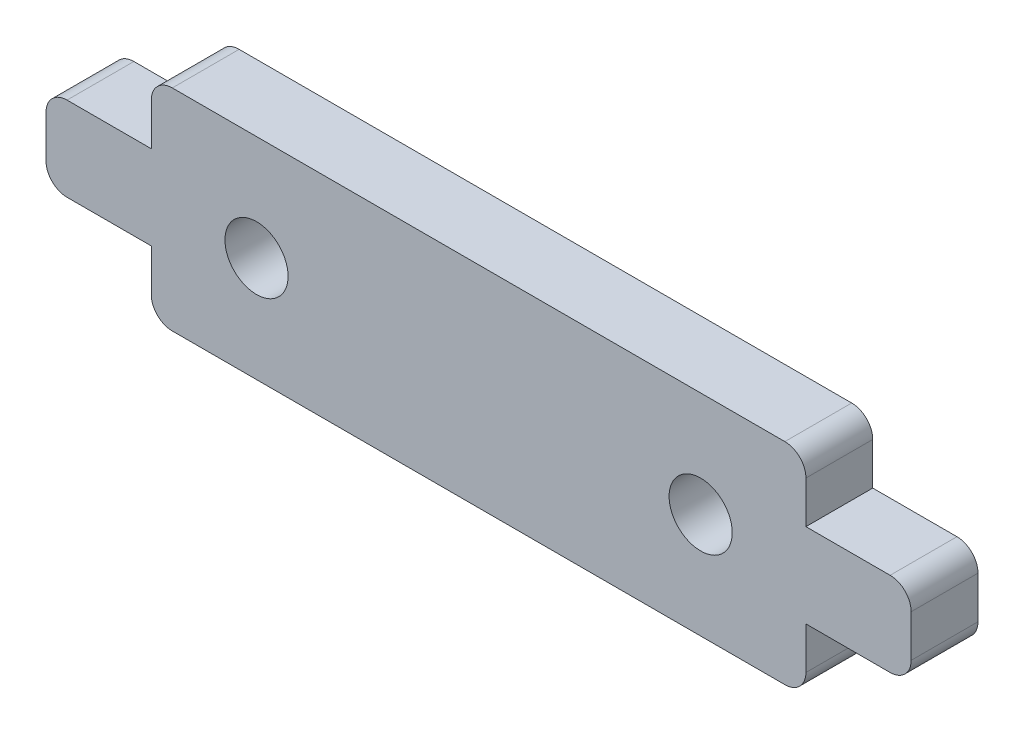
ISO-10303-21;
HEADER;
FILE_DESCRIPTION(('STEP AP214'),'2;1');
FILE_NAME('part.step','',(''),(''),'','','');
FILE_SCHEMA(('AUTOMOTIVE_DESIGN { 1 0 10303 214 1 1 1 1 }'));
ENDSEC;
DATA;
#1=APPLICATION_CONTEXT('core data for automotive mechanical design processes');
#2=APPLICATION_PROTOCOL_DEFINITION('international standard','automotive_design',2000,#1);
#3=PRODUCT_CONTEXT('',#1,'mechanical');
#4=PRODUCT('Part','Part','',(#3));
#5=PRODUCT_RELATED_PRODUCT_CATEGORY('part','',(#4));
#6=PRODUCT_DEFINITION_FORMATION('','',#4);
#7=PRODUCT_DEFINITION_CONTEXT('part definition',#1,'design');
#8=PRODUCT_DEFINITION('design','',#6,#7);
#9=PRODUCT_DEFINITION_SHAPE('','',#8);
#10=(LENGTH_UNIT() NAMED_UNIT(*) SI_UNIT(.MILLI.,.METRE.));
#11=(NAMED_UNIT(*) PLANE_ANGLE_UNIT() SI_UNIT($,.RADIAN.));
#12=(NAMED_UNIT(*) SI_UNIT($,.STERADIAN.) SOLID_ANGLE_UNIT());
#13=UNCERTAINTY_MEASURE_WITH_UNIT(LENGTH_MEASURE(1.E-05),#10,'distance_accuracy_value','');
#14=(GEOMETRIC_REPRESENTATION_CONTEXT(3) GLOBAL_UNCERTAINTY_ASSIGNED_CONTEXT((#13)) GLOBAL_UNIT_ASSIGNED_CONTEXT((#10,
#11,#12)) REPRESENTATION_CONTEXT('',''));
#15=CARTESIAN_POINT('',(0.,0.,0.));
#16=DIRECTION('',(0.,0.,1.));
#17=DIRECTION('',(1.,0.,0.));
#18=AXIS2_PLACEMENT_3D('',#15,#16,#17);
#19=CARTESIAN_POINT('',(0.,0.,3.175));
#20=DIRECTION('',(0.,0.,-1.));
#21=DIRECTION('',(-1.,0.,0.));
#22=AXIS2_PLACEMENT_3D('',#19,#20,#21);
#23=PLANE('',#22);
#24=DIRECTION('',(0.,-1.,0.));
#25=VECTOR('',#24,1.);
#26=CARTESIAN_POINT('',(5.,-2.,3.175));
#27=LINE('',#26,#25);
#28=CARTESIAN_POINT('',(5.,-2.,3.175));
#29=VERTEX_POINT('',#28);
#30=CARTESIAN_POINT('',(5.,-4.,3.175));
#31=VERTEX_POINT('',#30);
#32=EDGE_CURVE('E177',#29,#31,#27,.T.);
#33=ORIENTED_EDGE('',*,*,#32,.T.);
#34=CARTESIAN_POINT('',(6.,-4.,3.175));
#35=DIRECTION('',(0.,0.,-1.));
#36=DIRECTION('',(-1.,0.,0.));
#37=AXIS2_PLACEMENT_3D('',#34,#35,#36);
#38=CIRCLE('',#37,1.);
#39=CARTESIAN_POINT('',(6.,-5.,3.175));
#40=VERTEX_POINT('',#39);
#41=EDGE_CURVE('E241',#31,#40,#38,.F.);
#42=ORIENTED_EDGE('',*,*,#41,.T.);
#43=DIRECTION('',(1.,0.,0.));
#44=VECTOR('',#43,1.);
#45=CARTESIAN_POINT('',(5.,-5.,3.175));
#46=LINE('',#45,#44);
#47=CARTESIAN_POINT('',(35.1,-5.,3.175));
#48=VERTEX_POINT('',#47);
#49=EDGE_CURVE('E194',#40,#48,#46,.T.);
#50=ORIENTED_EDGE('',*,*,#49,.T.);
#51=CARTESIAN_POINT('',(35.1,-4.,3.175));
#52=DIRECTION('',(0.,0.,-1.));
#53=DIRECTION('',(-1.,0.,0.));
#54=AXIS2_PLACEMENT_3D('',#51,#52,#53);
#55=CIRCLE('',#54,1.);
#56=CARTESIAN_POINT('',(36.1,-4.,3.175));
#57=VERTEX_POINT('',#56);
#58=EDGE_CURVE('E233',#48,#57,#55,.F.);
#59=ORIENTED_EDGE('',*,*,#58,.T.);
#60=DIRECTION('',(0.,1.,0.));
#61=VECTOR('',#60,1.);
#62=CARTESIAN_POINT('',(36.1,-5.,3.175));
#63=LINE('',#62,#61);
#64=CARTESIAN_POINT('',(36.1,-2.,3.175));
#65=VERTEX_POINT('',#64);
#66=EDGE_CURVE('E282',#57,#65,#63,.T.);
#67=ORIENTED_EDGE('',*,*,#66,.T.);
#68=DIRECTION('',(1.,0.,0.));
#69=VECTOR('',#68,1.);
#70=CARTESIAN_POINT('',(36.1,-2.,3.175));
#71=LINE('',#70,#69);
#72=CARTESIAN_POINT('',(40.1,-2.,3.175));
#73=VERTEX_POINT('',#72);
#74=EDGE_CURVE('E274',#65,#73,#71,.T.);
#75=ORIENTED_EDGE('',*,*,#74,.T.);
#76=CARTESIAN_POINT('',(40.1,-1.,3.175));
#77=DIRECTION('',(0.,0.,-1.));
#78=DIRECTION('',(-1.,0.,0.));
#79=AXIS2_PLACEMENT_3D('',#76,#77,#78);
#80=CIRCLE('',#79,1.);
#81=CARTESIAN_POINT('',(41.1,-1.,3.175));
#82=VERTEX_POINT('',#81);
#83=EDGE_CURVE('E231',#73,#82,#80,.F.);
#84=ORIENTED_EDGE('',*,*,#83,.T.);
#85=DIRECTION('',(0.,1.,0.));
#86=VECTOR('',#85,1.);
#87=CARTESIAN_POINT('',(41.1,-2.,3.175));
#88=LINE('',#87,#86);
#89=CARTESIAN_POINT('',(41.1,1.,3.175));
#90=VERTEX_POINT('',#89);
#91=EDGE_CURVE('E284',#82,#90,#88,.T.);
#92=ORIENTED_EDGE('',*,*,#91,.T.);
#93=CARTESIAN_POINT('',(40.1,1.,3.175));
#94=DIRECTION('',(0.,0.,-1.));
#95=DIRECTION('',(-1.,0.,0.));
#96=AXIS2_PLACEMENT_3D('',#93,#94,#95);
#97=CIRCLE('',#96,1.);
#98=CARTESIAN_POINT('',(40.1,2.,3.175));
#99=VERTEX_POINT('',#98);
#100=EDGE_CURVE('E229',#90,#99,#97,.F.);
#101=ORIENTED_EDGE('',*,*,#100,.T.);
#102=DIRECTION('',(-1.,0.,0.));
#103=VECTOR('',#102,1.);
#104=CARTESIAN_POINT('',(36.1,2.,3.175));
#105=LINE('',#104,#103);
#106=CARTESIAN_POINT('',(36.1,2.,3.175));
#107=VERTEX_POINT('',#106);
#108=EDGE_CURVE('E347',#99,#107,#105,.T.);
#109=ORIENTED_EDGE('',*,*,#108,.T.);
#110=DIRECTION('',(0.,1.,0.));
#111=VECTOR('',#110,1.);
#112=CARTESIAN_POINT('',(36.1,5.,3.175));
#113=LINE('',#112,#111);
#114=CARTESIAN_POINT('',(36.1,4.,3.175));
#115=VERTEX_POINT('',#114);
#116=EDGE_CURVE('E328',#107,#115,#113,.T.);
#117=ORIENTED_EDGE('',*,*,#116,.T.);
#118=CARTESIAN_POINT('',(35.1,4.,3.175));
#119=DIRECTION('',(0.,0.,-1.));
#120=DIRECTION('',(-1.,0.,0.));
#121=AXIS2_PLACEMENT_3D('',#118,#119,#120);
#122=CIRCLE('',#121,1.);
#123=CARTESIAN_POINT('',(35.1,5.,3.175));
#124=VERTEX_POINT('',#123);
#125=EDGE_CURVE('E235',#115,#124,#122,.F.);
#126=ORIENTED_EDGE('',*,*,#125,.T.);
#127=DIRECTION('',(-1.,0.,0.));
#128=VECTOR('',#127,1.);
#129=CARTESIAN_POINT('',(5.,5.,3.175));
#130=LINE('',#129,#128);
#131=CARTESIAN_POINT('',(6.,5.,3.175));
#132=VERTEX_POINT('',#131);
#133=EDGE_CURVE('E341',#124,#132,#130,.T.);
#134=ORIENTED_EDGE('',*,*,#133,.T.);
#135=CARTESIAN_POINT('',(6.,4.,3.175));
#136=DIRECTION('',(0.,0.,-1.));
#137=DIRECTION('',(-1.,0.,0.));
#138=AXIS2_PLACEMENT_3D('',#135,#136,#137);
#139=CIRCLE('',#138,1.);
#140=CARTESIAN_POINT('',(5.,4.,3.175));
#141=VERTEX_POINT('',#140);
#142=EDGE_CURVE('E237',#132,#141,#139,.F.);
#143=ORIENTED_EDGE('',*,*,#142,.T.);
#144=DIRECTION('',(0.,-1.,0.));
#145=VECTOR('',#144,1.);
#146=CARTESIAN_POINT('',(5.,2.,3.175));
#147=LINE('',#146,#145);
#148=CARTESIAN_POINT('',(5.,2.,3.175));
#149=VERTEX_POINT('',#148);
#150=EDGE_CURVE('E343',#141,#149,#147,.T.);
#151=ORIENTED_EDGE('',*,*,#150,.T.);
#152=DIRECTION('',(-1.,0.,0.));
#153=VECTOR('',#152,1.);
#154=CARTESIAN_POINT('',(0.,2.,3.175));
#155=LINE('',#154,#153);
#156=CARTESIAN_POINT('',(1.,2.,3.175));
#157=VERTEX_POINT('',#156);
#158=EDGE_CURVE('E345',#149,#157,#155,.T.);
#159=ORIENTED_EDGE('',*,*,#158,.T.);
#160=CARTESIAN_POINT('',(1.,1.,3.175));
#161=DIRECTION('',(0.,0.,-1.));
#162=DIRECTION('',(-1.,0.,0.));
#163=AXIS2_PLACEMENT_3D('',#160,#161,#162);
#164=CIRCLE('',#163,1.);
#165=CARTESIAN_POINT('',(0.,1.,3.175));
#166=VERTEX_POINT('',#165);
#167=EDGE_CURVE('E58',#157,#166,#164,.F.);
#168=ORIENTED_EDGE('',*,*,#167,.T.);
#169=DIRECTION('',(0.,-1.,0.));
#170=VECTOR('',#169,1.);
#171=CARTESIAN_POINT('',(0.,2.,3.175));
#172=LINE('',#171,#170);
#173=CARTESIAN_POINT('',(0.,-1.,3.175));
#174=VERTEX_POINT('',#173);
#175=EDGE_CURVE('E319',#166,#174,#172,.T.);
#176=ORIENTED_EDGE('',*,*,#175,.T.);
#177=CARTESIAN_POINT('',(1.,-1.,3.175));
#178=DIRECTION('',(0.,0.,-1.));
#179=DIRECTION('',(-1.,0.,0.));
#180=AXIS2_PLACEMENT_3D('',#177,#178,#179);
#181=CIRCLE('',#180,1.);
#182=CARTESIAN_POINT('',(1.,-2.,3.175));
#183=VERTEX_POINT('',#182);
#184=EDGE_CURVE('E180',#174,#183,#181,.F.);
#185=ORIENTED_EDGE('',*,*,#184,.T.);
#186=DIRECTION('',(1.,0.,0.));
#187=VECTOR('',#186,1.);
#188=CARTESIAN_POINT('',(0.,-2.,3.175));
#189=LINE('',#188,#187);
#190=EDGE_CURVE('E174',#183,#29,#189,.T.);
#191=ORIENTED_EDGE('',*,*,#190,.T.);
#192=EDGE_LOOP('',(#33,#42,#50,#59,#67,#75,#84,#92,#101,#109,#117,#126,#134,#143,#151,#159,#168,
#176,#185,#191));
#193=FACE_BOUND('',#192,.T.);
#194=CARTESIAN_POINT('',(31.1,0.,3.175));
#195=DIRECTION('',(0.,0.,1.));
#196=DIRECTION('',(1.,0.,0.));
#197=AXIS2_PLACEMENT_3D('',#194,#195,#196);
#198=CIRCLE('',#197,1.49999999999999);
#199=CARTESIAN_POINT('',(32.6,0.,3.175));
#200=VERTEX_POINT('',#199);
#201=EDGE_CURVE('E590',#200,#200,#198,.T.);
#202=ORIENTED_EDGE('',*,*,#201,.F.);
#203=EDGE_LOOP('',(#202));
#204=FACE_BOUND('',#203,.T.);
#205=CARTESIAN_POINT('',(10.,0.,3.175));
#206=DIRECTION('',(0.,0.,1.));
#207=DIRECTION('',(1.,0.,0.));
#208=AXIS2_PLACEMENT_3D('',#205,#206,#207);
#209=CIRCLE('',#208,1.49999999999999);
#210=CARTESIAN_POINT('',(11.5,0.,3.175));
#211=VERTEX_POINT('',#210);
#212=EDGE_CURVE('E600',#211,#211,#209,.T.);
#213=ORIENTED_EDGE('',*,*,#212,.F.);
#214=EDGE_LOOP('',(#213));
#215=FACE_BOUND('',#214,.T.);
#216=ADVANCED_FACE('F36',(#193,#204,#215),#23,.F.);
#217=CARTESIAN_POINT('',(0.,-2.,3.175));
#218=DIRECTION('',(0.,1.,0.));
#219=DIRECTION('',(0.,0.,1.));
#220=AXIS2_PLACEMENT_3D('',#217,#218,#219);
#221=PLANE('',#220);
#222=ORIENTED_EDGE('',*,*,#190,.F.);
#223=DIRECTION('',(0.,0.,-1.));
#224=VECTOR('',#223,1.);
#225=CARTESIAN_POINT('',(1.,-2.,3.175));
#226=LINE('',#225,#224);
#227=CARTESIAN_POINT('',(1.,-2.,0.));
#228=VERTEX_POINT('',#227);
#229=EDGE_CURVE('E243',#183,#228,#226,.T.);
#230=ORIENTED_EDGE('',*,*,#229,.T.);
#231=DIRECTION('',(1.,0.,0.));
#232=VECTOR('',#231,1.);
#233=CARTESIAN_POINT('',(0.,-2.,0.));
#234=LINE('',#233,#232);
#235=CARTESIAN_POINT('',(5.,-2.,0.));
#236=VERTEX_POINT('',#235);
#237=EDGE_CURVE('E198',#228,#236,#234,.T.);
#238=ORIENTED_EDGE('',*,*,#237,.T.);
#239=DIRECTION('',(0.,0.,-1.));
#240=VECTOR('',#239,1.);
#241=CARTESIAN_POINT('',(5.,-2.,3.175));
#242=LINE('',#241,#240);
#243=EDGE_CURVE('E191',#29,#236,#242,.T.);
#244=ORIENTED_EDGE('',*,*,#243,.F.);
#245=EDGE_LOOP('',(#222,#230,#238,#244));
#246=FACE_BOUND('',#245,.T.);
#247=ADVANCED_FACE('F196',(#246),#221,.F.);
#248=CARTESIAN_POINT('',(5.,-2.,3.175));
#249=DIRECTION('',(1.,0.,0.));
#250=DIRECTION('',(0.,1.,0.));
#251=AXIS2_PLACEMENT_3D('',#248,#249,#250);
#252=PLANE('',#251);
#253=DIRECTION('',(0.,-1.,0.));
#254=VECTOR('',#253,1.);
#255=CARTESIAN_POINT('',(5.,-2.,0.));
#256=LINE('',#255,#254);
#257=CARTESIAN_POINT('',(5.,-4.,0.));
#258=VERTEX_POINT('',#257);
#259=EDGE_CURVE('E354',#236,#258,#256,.T.);
#260=ORIENTED_EDGE('',*,*,#259,.T.);
#261=DIRECTION('',(0.,0.,-1.));
#262=VECTOR('',#261,1.);
#263=CARTESIAN_POINT('',(5.,-4.,3.175));
#264=LINE('',#263,#262);
#265=EDGE_CURVE('E193',#258,#31,#264,.F.);
#266=ORIENTED_EDGE('',*,*,#265,.T.);
#267=ORIENTED_EDGE('',*,*,#32,.F.);
#268=ORIENTED_EDGE('',*,*,#243,.T.);
#269=EDGE_LOOP('',(#260,#266,#267,#268));
#270=FACE_BOUND('',#269,.T.);
#271=ADVANCED_FACE('F190',(#270),#252,.F.);
#272=CARTESIAN_POINT('',(5.,-5.,3.175));
#273=DIRECTION('',(0.,1.,0.));
#274=DIRECTION('',(-1.,0.,0.));
#275=AXIS2_PLACEMENT_3D('',#272,#273,#274);
#276=PLANE('',#275);
#277=ORIENTED_EDGE('',*,*,#49,.F.);
#278=DIRECTION('',(0.,0.,-1.));
#279=VECTOR('',#278,1.);
#280=CARTESIAN_POINT('',(6.,-5.,3.175));
#281=LINE('',#280,#279);
#282=CARTESIAN_POINT('',(6.,-5.,0.));
#283=VERTEX_POINT('',#282);
#284=EDGE_CURVE('E203',#40,#283,#281,.T.);
#285=ORIENTED_EDGE('',*,*,#284,.T.);
#286=DIRECTION('',(1.,0.,0.));
#287=VECTOR('',#286,1.);
#288=CARTESIAN_POINT('',(5.,-5.,0.));
#289=LINE('',#288,#287);
#290=CARTESIAN_POINT('',(35.1,-5.,0.));
#291=VERTEX_POINT('',#290);
#292=EDGE_CURVE('E357',#283,#291,#289,.T.);
#293=ORIENTED_EDGE('',*,*,#292,.T.);
#294=DIRECTION('',(0.,0.,-1.));
#295=VECTOR('',#294,1.);
#296=CARTESIAN_POINT('',(35.1,-5.,3.175));
#297=LINE('',#296,#295);
#298=EDGE_CURVE('E200',#291,#48,#297,.F.);
#299=ORIENTED_EDGE('',*,*,#298,.T.);
#300=EDGE_LOOP('',(#277,#285,#293,#299));
#301=FACE_BOUND('',#300,.T.);
#302=ADVANCED_FACE('F367',(#301),#276,.F.);
#303=CARTESIAN_POINT('',(36.1,-5.,3.175));
#304=DIRECTION('',(-1.,0.,0.));
#305=DIRECTION('',(0.,0.,1.));
#306=AXIS2_PLACEMENT_3D('',#303,#304,#305);
#307=PLANE('',#306);
#308=ORIENTED_EDGE('',*,*,#66,.F.);
#309=DIRECTION('',(0.,0.,-1.));
#310=VECTOR('',#309,1.);
#311=CARTESIAN_POINT('',(36.1,-4.,3.175));
#312=LINE('',#311,#310);
#313=CARTESIAN_POINT('',(36.1,-4.,0.));
#314=VERTEX_POINT('',#313);
#315=EDGE_CURVE('E261',#57,#314,#312,.T.);
#316=ORIENTED_EDGE('',*,*,#315,.T.);
#317=DIRECTION('',(0.,1.,0.));
#318=VECTOR('',#317,1.);
#319=CARTESIAN_POINT('',(36.1,-5.,0.));
#320=LINE('',#319,#318);
#321=CARTESIAN_POINT('',(36.1,-2.,0.));
#322=VERTEX_POINT('',#321);
#323=EDGE_CURVE('E302',#314,#322,#320,.T.);
#324=ORIENTED_EDGE('',*,*,#323,.T.);
#325=DIRECTION('',(0.,0.,-1.));
#326=VECTOR('',#325,1.);
#327=CARTESIAN_POINT('',(36.1,-2.,3.175));
#328=LINE('',#327,#326);
#329=EDGE_CURVE('E201',#65,#322,#328,.T.);
#330=ORIENTED_EDGE('',*,*,#329,.F.);
#331=EDGE_LOOP('',(#308,#316,#324,#330));
#332=FACE_BOUND('',#331,.T.);
#333=ADVANCED_FACE('F361',(#332),#307,.F.);
#334=CARTESIAN_POINT('',(36.1,-2.,3.175));
#335=DIRECTION('',(0.,1.,0.));
#336=DIRECTION('',(0.,0.,1.));
#337=AXIS2_PLACEMENT_3D('',#334,#335,#336);
#338=PLANE('',#337);
#339=DIRECTION('',(1.,0.,0.));
#340=VECTOR('',#339,1.);
#341=CARTESIAN_POINT('',(36.1,-2.,0.));
#342=LINE('',#341,#340);
#343=CARTESIAN_POINT('',(40.1,-2.,0.));
#344=VERTEX_POINT('',#343);
#345=EDGE_CURVE('E276',#322,#344,#342,.T.);
#346=ORIENTED_EDGE('',*,*,#345,.T.);
#347=DIRECTION('',(0.,0.,-1.));
#348=VECTOR('',#347,1.);
#349=CARTESIAN_POINT('',(40.1,-2.,3.175));
#350=LINE('',#349,#348);
#351=EDGE_CURVE('E44',#344,#73,#350,.F.);
#352=ORIENTED_EDGE('',*,*,#351,.T.);
#353=ORIENTED_EDGE('',*,*,#74,.F.);
#354=ORIENTED_EDGE('',*,*,#329,.T.);
#355=EDGE_LOOP('',(#346,#352,#353,#354));
#356=FACE_BOUND('',#355,.T.);
#357=ADVANCED_FACE('F273',(#356),#338,.F.);
#358=CARTESIAN_POINT('',(41.1,-2.,3.175));
#359=DIRECTION('',(-1.,0.,0.));
#360=DIRECTION('',(0.,0.,1.));
#361=AXIS2_PLACEMENT_3D('',#358,#359,#360);
#362=PLANE('',#361);
#363=ORIENTED_EDGE('',*,*,#91,.F.);
#364=DIRECTION('',(0.,0.,-1.));
#365=VECTOR('',#364,1.);
#366=CARTESIAN_POINT('',(41.1,-1.,3.175));
#367=LINE('',#366,#365);
#368=CARTESIAN_POINT('',(41.1,-1.,0.));
#369=VERTEX_POINT('',#368);
#370=EDGE_CURVE('E266',#82,#369,#367,.T.);
#371=ORIENTED_EDGE('',*,*,#370,.T.);
#372=DIRECTION('',(0.,1.,0.));
#373=VECTOR('',#372,1.);
#374=CARTESIAN_POINT('',(41.1,-2.,0.));
#375=LINE('',#374,#373);
#376=CARTESIAN_POINT('',(41.1,1.,0.));
#377=VERTEX_POINT('',#376);
#378=EDGE_CURVE('E292',#369,#377,#375,.T.);
#379=ORIENTED_EDGE('',*,*,#378,.T.);
#380=DIRECTION('',(0.,0.,-1.));
#381=VECTOR('',#380,1.);
#382=CARTESIAN_POINT('',(41.1,1.,3.175));
#383=LINE('',#382,#381);
#384=EDGE_CURVE('E264',#377,#90,#383,.F.);
#385=ORIENTED_EDGE('',*,*,#384,.T.);
#386=EDGE_LOOP('',(#363,#371,#379,#385));
#387=FACE_BOUND('',#386,.T.);
#388=ADVANCED_FACE('F291',(#387),#362,.F.);
#389=CARTESIAN_POINT('',(36.1,2.,3.175));
#390=DIRECTION('',(0.,-1.,0.));
#391=DIRECTION('',(0.,0.,-1.));
#392=AXIS2_PLACEMENT_3D('',#389,#390,#391);
#393=PLANE('',#392);
#394=ORIENTED_EDGE('',*,*,#108,.F.);
#395=DIRECTION('',(0.,0.,-1.));
#396=VECTOR('',#395,1.);
#397=CARTESIAN_POINT('',(40.1,2.,3.175));
#398=LINE('',#397,#396);
#399=CARTESIAN_POINT('',(40.1,2.,0.));
#400=VERTEX_POINT('',#399);
#401=EDGE_CURVE('E11',#99,#400,#398,.T.);
#402=ORIENTED_EDGE('',*,*,#401,.T.);
#403=DIRECTION('',(-1.,0.,0.));
#404=VECTOR('',#403,1.);
#405=CARTESIAN_POINT('',(36.1,2.,0.));
#406=LINE('',#405,#404);
#407=CARTESIAN_POINT('',(36.1,2.,0.));
#408=VERTEX_POINT('',#407);
#409=EDGE_CURVE('E298',#400,#408,#406,.T.);
#410=ORIENTED_EDGE('',*,*,#409,.T.);
#411=DIRECTION('',(0.,0.,-1.));
#412=VECTOR('',#411,1.);
#413=CARTESIAN_POINT('',(36.1,2.,3.175));
#414=LINE('',#413,#412);
#415=EDGE_CURVE('E206',#107,#408,#414,.T.);
#416=ORIENTED_EDGE('',*,*,#415,.F.);
#417=EDGE_LOOP('',(#394,#402,#410,#416));
#418=FACE_BOUND('',#417,.T.);
#419=ADVANCED_FACE('F377',(#418),#393,.F.);
#420=CARTESIAN_POINT('',(36.1,5.,3.175));
#421=DIRECTION('',(-1.,0.,0.));
#422=DIRECTION('',(0.,0.,1.));
#423=AXIS2_PLACEMENT_3D('',#420,#421,#422);
#424=PLANE('',#423);
#425=DIRECTION('',(0.,1.,0.));
#426=VECTOR('',#425,1.);
#427=CARTESIAN_POINT('',(36.1,5.,0.));
#428=LINE('',#427,#426);
#429=CARTESIAN_POINT('',(36.1,4.,0.));
#430=VERTEX_POINT('',#429);
#431=EDGE_CURVE('E300',#408,#430,#428,.T.);
#432=ORIENTED_EDGE('',*,*,#431,.T.);
#433=DIRECTION('',(0.,0.,-1.));
#434=VECTOR('',#433,1.);
#435=CARTESIAN_POINT('',(36.1,4.,3.175));
#436=LINE('',#435,#434);
#437=EDGE_CURVE('E259',#430,#115,#436,.F.);
#438=ORIENTED_EDGE('',*,*,#437,.T.);
#439=ORIENTED_EDGE('',*,*,#116,.F.);
#440=ORIENTED_EDGE('',*,*,#415,.T.);
#441=EDGE_LOOP('',(#432,#438,#439,#440));
#442=FACE_BOUND('',#441,.T.);
#443=ADVANCED_FACE('F325',(#442),#424,.F.);
#444=CARTESIAN_POINT('',(5.,5.,3.175));
#445=DIRECTION('',(0.,-1.,0.));
#446=DIRECTION('',(1.,0.,0.));
#447=AXIS2_PLACEMENT_3D('',#444,#445,#446);
#448=PLANE('',#447);
#449=DIRECTION('',(-1.,0.,0.));
#450=VECTOR('',#449,1.);
#451=CARTESIAN_POINT('',(5.,5.,0.));
#452=LINE('',#451,#450);
#453=CARTESIAN_POINT('',(35.1,5.,0.));
#454=VERTEX_POINT('',#453);
#455=CARTESIAN_POINT('',(6.,5.,0.));
#456=VERTEX_POINT('',#455);
#457=EDGE_CURVE('E308',#454,#456,#452,.T.);
#458=ORIENTED_EDGE('',*,*,#457,.T.);
#459=DIRECTION('',(0.,0.,-1.));
#460=VECTOR('',#459,1.);
#461=CARTESIAN_POINT('',(6.,5.,3.175));
#462=LINE('',#461,#460);
#463=EDGE_CURVE('E257',#456,#132,#462,.F.);
#464=ORIENTED_EDGE('',*,*,#463,.T.);
#465=ORIENTED_EDGE('',*,*,#133,.F.);
#466=DIRECTION('',(0.,0.,-1.));
#467=VECTOR('',#466,1.);
#468=CARTESIAN_POINT('',(35.1,5.,3.175));
#469=LINE('',#468,#467);
#470=EDGE_CURVE('E254',#124,#454,#469,.T.);
#471=ORIENTED_EDGE('',*,*,#470,.T.);
#472=EDGE_LOOP('',(#458,#464,#465,#471));
#473=FACE_BOUND('',#472,.T.);
#474=ADVANCED_FACE('F338',(#473),#448,.F.);
#475=CARTESIAN_POINT('',(5.,2.,3.175));
#476=DIRECTION('',(1.,0.,0.));
#477=DIRECTION('',(0.,1.,0.));
#478=AXIS2_PLACEMENT_3D('',#475,#476,#477);
#479=PLANE('',#478);
#480=ORIENTED_EDGE('',*,*,#150,.F.);
#481=DIRECTION('',(0.,0.,-1.));
#482=VECTOR('',#481,1.);
#483=CARTESIAN_POINT('',(5.,4.,3.175));
#484=LINE('',#483,#482);
#485=CARTESIAN_POINT('',(5.,4.,0.));
#486=VERTEX_POINT('',#485);
#487=EDGE_CURVE('E251',#141,#486,#484,.T.);
#488=ORIENTED_EDGE('',*,*,#487,.T.);
#489=DIRECTION('',(0.,-1.,0.));
#490=VECTOR('',#489,1.);
#491=CARTESIAN_POINT('',(5.,2.,0.));
#492=LINE('',#491,#490);
#493=CARTESIAN_POINT('',(5.,2.,0.));
#494=VERTEX_POINT('',#493);
#495=EDGE_CURVE('E311',#486,#494,#492,.T.);
#496=ORIENTED_EDGE('',*,*,#495,.T.);
#497=DIRECTION('',(0.,0.,-1.));
#498=VECTOR('',#497,1.);
#499=CARTESIAN_POINT('',(5.,2.,3.175));
#500=LINE('',#499,#498);
#501=EDGE_CURVE('E317',#149,#494,#500,.T.);
#502=ORIENTED_EDGE('',*,*,#501,.F.);
#503=EDGE_LOOP('',(#480,#488,#496,#502));
#504=FACE_BOUND('',#503,.T.);
#505=ADVANCED_FACE('F402',(#504),#479,.F.);
#506=CARTESIAN_POINT('',(0.,2.,3.175));
#507=DIRECTION('',(0.,-1.,0.));
#508=DIRECTION('',(0.,0.,-1.));
#509=AXIS2_PLACEMENT_3D('',#506,#507,#508);
#510=PLANE('',#509);
#511=DIRECTION('',(-1.,0.,0.));
#512=VECTOR('',#511,1.);
#513=CARTESIAN_POINT('',(0.,2.,0.));
#514=LINE('',#513,#512);
#515=CARTESIAN_POINT('',(1.,2.,0.));
#516=VERTEX_POINT('',#515);
#517=EDGE_CURVE('E313',#494,#516,#514,.T.);
#518=ORIENTED_EDGE('',*,*,#517,.T.);
#519=DIRECTION('',(0.,0.,-1.));
#520=VECTOR('',#519,1.);
#521=CARTESIAN_POINT('',(1.,2.,3.175));
#522=LINE('',#521,#520);
#523=EDGE_CURVE('E249',#516,#157,#522,.F.);
#524=ORIENTED_EDGE('',*,*,#523,.T.);
#525=ORIENTED_EDGE('',*,*,#158,.F.);
#526=ORIENTED_EDGE('',*,*,#501,.T.);
#527=EDGE_LOOP('',(#518,#524,#525,#526));
#528=FACE_BOUND('',#527,.T.);
#529=ADVANCED_FACE('F399',(#528),#510,.F.);
#530=CARTESIAN_POINT('',(0.,2.,3.175));
#531=DIRECTION('',(1.,0.,0.));
#532=DIRECTION('',(0.,0.,-1.));
#533=AXIS2_PLACEMENT_3D('',#530,#531,#532);
#534=PLANE('',#533);
#535=DIRECTION('',(0.,-1.,0.));
#536=VECTOR('',#535,1.);
#537=CARTESIAN_POINT('',(0.,2.,0.));
#538=LINE('',#537,#536);
#539=CARTESIAN_POINT('',(0.,1.,0.));
#540=VERTEX_POINT('',#539);
#541=CARTESIAN_POINT('',(0.,-1.,0.));
#542=VERTEX_POINT('',#541);
#543=EDGE_CURVE('E185',#540,#542,#538,.T.);
#544=ORIENTED_EDGE('',*,*,#543,.T.);
#545=DIRECTION('',(0.,0.,-1.));
#546=VECTOR('',#545,1.);
#547=CARTESIAN_POINT('',(0.,-1.,3.175));
#548=LINE('',#547,#546);
#549=EDGE_CURVE('E51',#542,#174,#548,.F.);
#550=ORIENTED_EDGE('',*,*,#549,.T.);
#551=ORIENTED_EDGE('',*,*,#175,.F.);
#552=DIRECTION('',(0.,0.,-1.));
#553=VECTOR('',#552,1.);
#554=CARTESIAN_POINT('',(0.,1.,3.175));
#555=LINE('',#554,#553);
#556=EDGE_CURVE('E245',#166,#540,#555,.T.);
#557=ORIENTED_EDGE('',*,*,#556,.T.);
#558=EDGE_LOOP('',(#544,#550,#551,#557));
#559=FACE_BOUND('',#558,.T.);
#560=ADVANCED_FACE('F395',(#559),#534,.F.);
#561=CARTESIAN_POINT('',(0.,0.,0.));
#562=DIRECTION('',(0.,0.,-1.));
#563=DIRECTION('',(-1.,0.,0.));
#564=AXIS2_PLACEMENT_3D('',#561,#562,#563);
#565=PLANE('',#564);
#566=CARTESIAN_POINT('',(10.,0.,0.));
#567=DIRECTION('',(0.,0.,-1.));
#568=DIRECTION('',(-1.,0.,0.));
#569=AXIS2_PLACEMENT_3D('',#566,#567,#568);
#570=CIRCLE('',#569,1.49999999999999);
#571=CARTESIAN_POINT('',(8.50000000000001,0.,0.));
#572=VERTEX_POINT('',#571);
#573=EDGE_CURVE('E595',#572,#572,#570,.T.);
#574=ORIENTED_EDGE('',*,*,#573,.F.);
#575=EDGE_LOOP('',(#574));
#576=FACE_BOUND('',#575,.T.);
#577=CARTESIAN_POINT('',(31.1,0.,0.));
#578=DIRECTION('',(0.,0.,-1.));
#579=DIRECTION('',(-1.,0.,0.));
#580=AXIS2_PLACEMENT_3D('',#577,#578,#579);
#581=CIRCLE('',#580,1.49999999999999);
#582=CARTESIAN_POINT('',(29.6,0.,0.));
#583=VERTEX_POINT('',#582);
#584=EDGE_CURVE('E355',#583,#583,#581,.T.);
#585=ORIENTED_EDGE('',*,*,#584,.F.);
#586=EDGE_LOOP('',(#585));
#587=FACE_BOUND('',#586,.T.);
#588=ORIENTED_EDGE('',*,*,#292,.F.);
#589=CARTESIAN_POINT('',(6.,-4.,0.));
#590=DIRECTION('',(0.,0.,-1.));
#591=DIRECTION('',(-1.,0.,0.));
#592=AXIS2_PLACEMENT_3D('',#589,#590,#591);
#593=CIRCLE('',#592,1.);
#594=EDGE_CURVE('E226',#283,#258,#593,.T.);
#595=ORIENTED_EDGE('',*,*,#594,.T.);
#596=ORIENTED_EDGE('',*,*,#259,.F.);
#597=ORIENTED_EDGE('',*,*,#237,.F.);
#598=CARTESIAN_POINT('',(1.,-1.,0.));
#599=DIRECTION('',(0.,0.,-1.));
#600=DIRECTION('',(-1.,0.,0.));
#601=AXIS2_PLACEMENT_3D('',#598,#599,#600);
#602=CIRCLE('',#601,1.);
#603=EDGE_CURVE('E224',#228,#542,#602,.T.);
#604=ORIENTED_EDGE('',*,*,#603,.T.);
#605=ORIENTED_EDGE('',*,*,#543,.F.);
#606=CARTESIAN_POINT('',(1.,1.,0.));
#607=DIRECTION('',(0.,0.,-1.));
#608=DIRECTION('',(-1.,0.,0.));
#609=AXIS2_PLACEMENT_3D('',#606,#607,#608);
#610=CIRCLE('',#609,1.);
#611=EDGE_CURVE('E222',#540,#516,#610,.T.);
#612=ORIENTED_EDGE('',*,*,#611,.T.);
#613=ORIENTED_EDGE('',*,*,#517,.F.);
#614=ORIENTED_EDGE('',*,*,#495,.F.);
#615=CARTESIAN_POINT('',(6.,4.,0.));
#616=DIRECTION('',(0.,0.,-1.));
#617=DIRECTION('',(-1.,0.,0.));
#618=AXIS2_PLACEMENT_3D('',#615,#616,#617);
#619=CIRCLE('',#618,1.);
#620=EDGE_CURVE('E220',#486,#456,#619,.T.);
#621=ORIENTED_EDGE('',*,*,#620,.T.);
#622=ORIENTED_EDGE('',*,*,#457,.F.);
#623=CARTESIAN_POINT('',(35.1,4.,0.));
#624=DIRECTION('',(0.,0.,-1.));
#625=DIRECTION('',(-1.,0.,0.));
#626=AXIS2_PLACEMENT_3D('',#623,#624,#625);
#627=CIRCLE('',#626,1.);
#628=EDGE_CURVE('E218',#454,#430,#627,.T.);
#629=ORIENTED_EDGE('',*,*,#628,.T.);
#630=ORIENTED_EDGE('',*,*,#431,.F.);
#631=ORIENTED_EDGE('',*,*,#409,.F.);
#632=CARTESIAN_POINT('',(40.1,1.,0.));
#633=DIRECTION('',(0.,0.,-1.));
#634=DIRECTION('',(-1.,0.,0.));
#635=AXIS2_PLACEMENT_3D('',#632,#633,#634);
#636=CIRCLE('',#635,1.);
#637=EDGE_CURVE('E212',#400,#377,#636,.T.);
#638=ORIENTED_EDGE('',*,*,#637,.T.);
#639=ORIENTED_EDGE('',*,*,#378,.F.);
#640=CARTESIAN_POINT('',(40.1,-1.,0.));
#641=DIRECTION('',(0.,0.,-1.));
#642=DIRECTION('',(-1.,0.,0.));
#643=AXIS2_PLACEMENT_3D('',#640,#641,#642);
#644=CIRCLE('',#643,1.);
#645=EDGE_CURVE('E214',#369,#344,#644,.T.);
#646=ORIENTED_EDGE('',*,*,#645,.T.);
#647=ORIENTED_EDGE('',*,*,#345,.F.);
#648=ORIENTED_EDGE('',*,*,#323,.F.);
#649=CARTESIAN_POINT('',(35.1,-4.,0.));
#650=DIRECTION('',(0.,0.,-1.));
#651=DIRECTION('',(-1.,0.,0.));
#652=AXIS2_PLACEMENT_3D('',#649,#650,#651);
#653=CIRCLE('',#652,1.);
#654=EDGE_CURVE('E216',#314,#291,#653,.T.);
#655=ORIENTED_EDGE('',*,*,#654,.T.);
#656=EDGE_LOOP('',(#588,#595,#596,#597,#604,#605,#612,#613,#614,#621,#622,#629,#630,#631,#638,
#639,#646,#647,#648,#655));
#657=FACE_BOUND('',#656,.T.);
#658=ADVANCED_FACE('F296',(#576,#587,#657),#565,.T.);
#659=CARTESIAN_POINT('',(31.1,0.,3.175));
#660=DIRECTION('',(0.,0.,1.));
#661=DIRECTION('',(1.,0.,0.));
#662=AXIS2_PLACEMENT_3D('',#659,#660,#661);
#663=CYLINDRICAL_SURFACE('',#662,1.49999999999999);
#664=ORIENTED_EDGE('',*,*,#201,.T.);
#665=EDGE_LOOP('',(#664));
#666=FACE_BOUND('',#665,.T.);
#667=ORIENTED_EDGE('',*,*,#584,.T.);
#668=EDGE_LOOP('',(#667));
#669=FACE_BOUND('',#668,.T.);
#670=ADVANCED_FACE('F391',(#666,#669),#663,.F.);
#671=CARTESIAN_POINT('',(10.,0.,3.175));
#672=DIRECTION('',(0.,0.,1.));
#673=DIRECTION('',(1.,0.,0.));
#674=AXIS2_PLACEMENT_3D('',#671,#672,#673);
#675=CYLINDRICAL_SURFACE('',#674,1.49999999999999);
#676=ORIENTED_EDGE('',*,*,#212,.T.);
#677=EDGE_LOOP('',(#676));
#678=FACE_BOUND('',#677,.T.);
#679=ORIENTED_EDGE('',*,*,#573,.T.);
#680=EDGE_LOOP('',(#679));
#681=FACE_BOUND('',#680,.T.);
#682=ADVANCED_FACE('F427',(#678,#681),#675,.F.);
#683=CARTESIAN_POINT('',(6.,-4.,3.175));
#684=DIRECTION('',(0.,0.,-1.));
#685=DIRECTION('',(-1.,0.,0.));
#686=AXIS2_PLACEMENT_3D('',#683,#684,#685);
#687=CYLINDRICAL_SURFACE('',#686,1.);
#688=ORIENTED_EDGE('',*,*,#41,.F.);
#689=ORIENTED_EDGE('',*,*,#265,.F.);
#690=ORIENTED_EDGE('',*,*,#594,.F.);
#691=ORIENTED_EDGE('',*,*,#284,.F.);
#692=EDGE_LOOP('',(#688,#689,#690,#691));
#693=FACE_BOUND('',#692,.T.);
#694=ADVANCED_FACE('F423',(#693),#687,.T.);
#695=CARTESIAN_POINT('',(1.,-1.,3.175));
#696=DIRECTION('',(0.,0.,-1.));
#697=DIRECTION('',(-1.,0.,0.));
#698=AXIS2_PLACEMENT_3D('',#695,#696,#697);
#699=CYLINDRICAL_SURFACE('',#698,1.);
#700=ORIENTED_EDGE('',*,*,#184,.F.);
#701=ORIENTED_EDGE('',*,*,#549,.F.);
#702=ORIENTED_EDGE('',*,*,#603,.F.);
#703=ORIENTED_EDGE('',*,*,#229,.F.);
#704=EDGE_LOOP('',(#700,#701,#702,#703));
#705=FACE_BOUND('',#704,.T.);
#706=ADVANCED_FACE('F426',(#705),#699,.T.);
#707=CARTESIAN_POINT('',(1.,1.,3.175));
#708=DIRECTION('',(0.,0.,-1.));
#709=DIRECTION('',(-1.,0.,0.));
#710=AXIS2_PLACEMENT_3D('',#707,#708,#709);
#711=CYLINDRICAL_SURFACE('',#710,1.);
#712=ORIENTED_EDGE('',*,*,#167,.F.);
#713=ORIENTED_EDGE('',*,*,#523,.F.);
#714=ORIENTED_EDGE('',*,*,#611,.F.);
#715=ORIENTED_EDGE('',*,*,#556,.F.);
#716=EDGE_LOOP('',(#712,#713,#714,#715));
#717=FACE_BOUND('',#716,.T.);
#718=ADVANCED_FACE('F431',(#717),#711,.T.);
#719=CARTESIAN_POINT('',(6.,4.,3.175));
#720=DIRECTION('',(0.,0.,-1.));
#721=DIRECTION('',(-1.,0.,0.));
#722=AXIS2_PLACEMENT_3D('',#719,#720,#721);
#723=CYLINDRICAL_SURFACE('',#722,1.);
#724=ORIENTED_EDGE('',*,*,#142,.F.);
#725=ORIENTED_EDGE('',*,*,#463,.F.);
#726=ORIENTED_EDGE('',*,*,#620,.F.);
#727=ORIENTED_EDGE('',*,*,#487,.F.);
#728=EDGE_LOOP('',(#724,#725,#726,#727));
#729=FACE_BOUND('',#728,.T.);
#730=ADVANCED_FACE('F435',(#729),#723,.T.);
#731=CARTESIAN_POINT('',(35.1,4.,3.175));
#732=DIRECTION('',(0.,0.,-1.));
#733=DIRECTION('',(-1.,0.,0.));
#734=AXIS2_PLACEMENT_3D('',#731,#732,#733);
#735=CYLINDRICAL_SURFACE('',#734,1.);
#736=ORIENTED_EDGE('',*,*,#125,.F.);
#737=ORIENTED_EDGE('',*,*,#437,.F.);
#738=ORIENTED_EDGE('',*,*,#628,.F.);
#739=ORIENTED_EDGE('',*,*,#470,.F.);
#740=EDGE_LOOP('',(#736,#737,#738,#739));
#741=FACE_BOUND('',#740,.T.);
#742=ADVANCED_FACE('F335',(#741),#735,.T.);
#743=CARTESIAN_POINT('',(35.1,-4.,3.175));
#744=DIRECTION('',(0.,0.,-1.));
#745=DIRECTION('',(-1.,0.,0.));
#746=AXIS2_PLACEMENT_3D('',#743,#744,#745);
#747=CYLINDRICAL_SURFACE('',#746,1.);
#748=ORIENTED_EDGE('',*,*,#58,.F.);
#749=ORIENTED_EDGE('',*,*,#298,.F.);
#750=ORIENTED_EDGE('',*,*,#654,.F.);
#751=ORIENTED_EDGE('',*,*,#315,.F.);
#752=EDGE_LOOP('',(#748,#749,#750,#751));
#753=FACE_BOUND('',#752,.T.);
#754=ADVANCED_FACE('F371',(#753),#747,.T.);
#755=CARTESIAN_POINT('',(40.1,-1.,3.175));
#756=DIRECTION('',(0.,0.,-1.));
#757=DIRECTION('',(-1.,0.,0.));
#758=AXIS2_PLACEMENT_3D('',#755,#756,#757);
#759=CYLINDRICAL_SURFACE('',#758,1.);
#760=ORIENTED_EDGE('',*,*,#83,.F.);
#761=ORIENTED_EDGE('',*,*,#351,.F.);
#762=ORIENTED_EDGE('',*,*,#645,.F.);
#763=ORIENTED_EDGE('',*,*,#370,.F.);
#764=EDGE_LOOP('',(#760,#761,#762,#763));
#765=FACE_BOUND('',#764,.T.);
#766=ADVANCED_FACE('F287',(#765),#759,.T.);
#767=CARTESIAN_POINT('',(40.1,1.,3.175));
#768=DIRECTION('',(0.,0.,-1.));
#769=DIRECTION('',(-1.,0.,0.));
#770=AXIS2_PLACEMENT_3D('',#767,#768,#769);
#771=CYLINDRICAL_SURFACE('',#770,1.);
#772=ORIENTED_EDGE('',*,*,#100,.F.);
#773=ORIENTED_EDGE('',*,*,#384,.F.);
#774=ORIENTED_EDGE('',*,*,#637,.F.);
#775=ORIENTED_EDGE('',*,*,#401,.F.);
#776=EDGE_LOOP('',(#772,#773,#774,#775));
#777=FACE_BOUND('',#776,.T.);
#778=ADVANCED_FACE('F38',(#777),#771,.T.);
#779=CLOSED_SHELL('',(#216,#247,#271,#302,#333,#357,#388,#419,#443,#474,#505,#529,#560,#658,
#670,#682,#694,#706,#718,#730,#742,#754,#766,#778));
#780=MANIFOLD_SOLID_BREP('B2',#779);
#781=ADVANCED_BREP_SHAPE_REPRESENTATION('',(#18,#780),#14);
#782=SHAPE_DEFINITION_REPRESENTATION(#9,#781);
ENDSEC;
END-ISO-10303-21;
